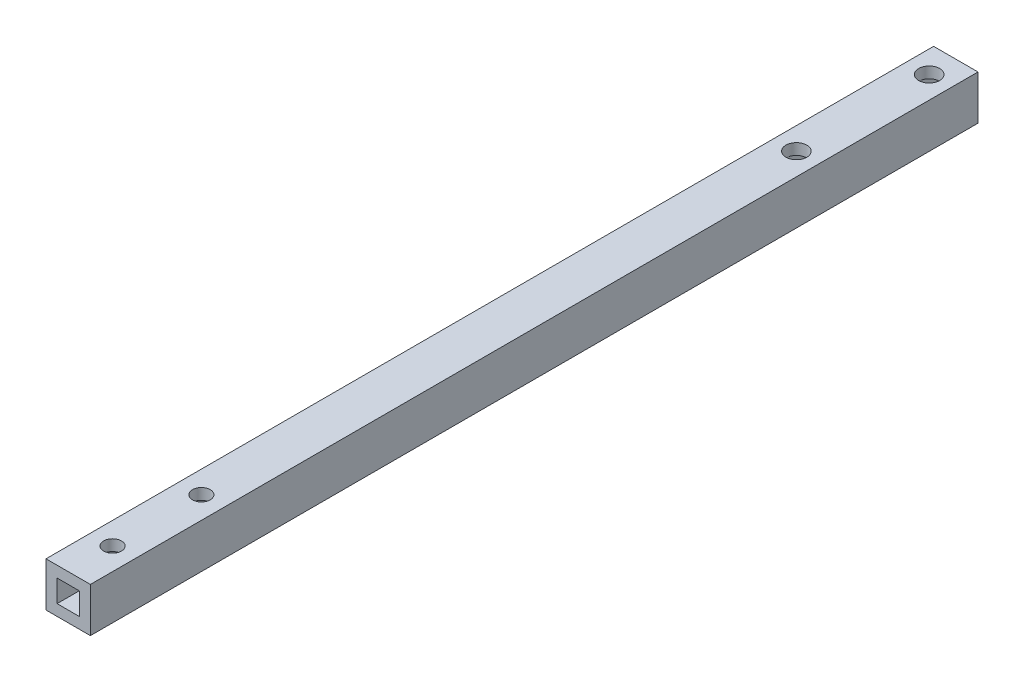
ISO-10303-21;
HEADER;
FILE_DESCRIPTION(('STEP AP214'),'2;1');
FILE_NAME('part.step','',(''),(''),'','','');
FILE_SCHEMA(('AUTOMOTIVE_DESIGN { 1 0 10303 214 1 1 1 1 }'));
ENDSEC;
DATA;
#1=APPLICATION_CONTEXT('core data for automotive mechanical design processes');
#2=APPLICATION_PROTOCOL_DEFINITION('international standard','automotive_design',2000,#1);
#3=PRODUCT_CONTEXT('',#1,'mechanical');
#4=PRODUCT('Part','Part','',(#3));
#5=PRODUCT_RELATED_PRODUCT_CATEGORY('part','',(#4));
#6=PRODUCT_DEFINITION_FORMATION('','',#4);
#7=PRODUCT_DEFINITION_CONTEXT('part definition',#1,'design');
#8=PRODUCT_DEFINITION('design','',#6,#7);
#9=PRODUCT_DEFINITION_SHAPE('','',#8);
#10=(LENGTH_UNIT() NAMED_UNIT(*) SI_UNIT(.MILLI.,.METRE.));
#11=(NAMED_UNIT(*) PLANE_ANGLE_UNIT() SI_UNIT($,.RADIAN.));
#12=(NAMED_UNIT(*) SI_UNIT($,.STERADIAN.) SOLID_ANGLE_UNIT());
#13=UNCERTAINTY_MEASURE_WITH_UNIT(LENGTH_MEASURE(1.E-05),#10,'distance_accuracy_value','');
#14=(GEOMETRIC_REPRESENTATION_CONTEXT(3) GLOBAL_UNCERTAINTY_ASSIGNED_CONTEXT((#13)) GLOBAL_UNIT_ASSIGNED_CONTEXT((#10,
#11,#12)) REPRESENTATION_CONTEXT('',''));
#15=CARTESIAN_POINT('',(0.,0.,0.));
#16=DIRECTION('',(0.,0.,1.));
#17=DIRECTION('',(1.,0.,0.));
#18=AXIS2_PLACEMENT_3D('',#15,#16,#17);
#19=CARTESIAN_POINT('',(0.,0.,127.));
#20=DIRECTION('',(0.,0.,-1.));
#21=DIRECTION('',(-1.,0.,0.));
#22=AXIS2_PLACEMENT_3D('',#19,#20,#21);
#23=PLANE('',#22);
#24=DIRECTION('',(0.,1.,0.));
#25=VECTOR('',#24,1.);
#26=CARTESIAN_POINT('',(3.175,-3.175,127.));
#27=LINE('',#26,#25);
#28=CARTESIAN_POINT('',(3.175,-3.175,127.));
#29=VERTEX_POINT('',#28);
#30=CARTESIAN_POINT('',(3.175,3.175,127.));
#31=VERTEX_POINT('',#30);
#32=EDGE_CURVE('E138',#29,#31,#27,.T.);
#33=ORIENTED_EDGE('',*,*,#32,.T.);
#34=DIRECTION('',(-1.,0.,0.));
#35=VECTOR('',#34,1.);
#36=CARTESIAN_POINT('',(-3.175,3.175,127.));
#37=LINE('',#36,#35);
#38=CARTESIAN_POINT('',(-3.175,3.175,127.));
#39=VERTEX_POINT('',#38);
#40=EDGE_CURVE('E141',#31,#39,#37,.T.);
#41=ORIENTED_EDGE('',*,*,#40,.T.);
#42=DIRECTION('',(0.,-1.,0.));
#43=VECTOR('',#42,1.);
#44=CARTESIAN_POINT('',(-3.175,-3.175,127.));
#45=LINE('',#44,#43);
#46=CARTESIAN_POINT('',(-3.175,-3.175,127.));
#47=VERTEX_POINT('',#46);
#48=EDGE_CURVE('E144',#39,#47,#45,.T.);
#49=ORIENTED_EDGE('',*,*,#48,.T.);
#50=DIRECTION('',(1.,0.,0.));
#51=VECTOR('',#50,1.);
#52=CARTESIAN_POINT('',(-3.175,-3.175,127.));
#53=LINE('',#52,#51);
#54=EDGE_CURVE('E146',#47,#29,#53,.T.);
#55=ORIENTED_EDGE('',*,*,#54,.T.);
#56=EDGE_LOOP('',(#33,#41,#49,#55));
#57=FACE_BOUND('',#56,.T.);
#58=DIRECTION('',(0.,1.,0.));
#59=VECTOR('',#58,1.);
#60=CARTESIAN_POINT('',(1.5875,-1.5875,127.));
#61=LINE('',#60,#59);
#62=CARTESIAN_POINT('',(1.5875,-1.5875,127.));
#63=VERTEX_POINT('',#62);
#64=CARTESIAN_POINT('',(1.5875,1.5875,127.));
#65=VERTEX_POINT('',#64);
#66=EDGE_CURVE('E100',#63,#65,#61,.T.);
#67=ORIENTED_EDGE('',*,*,#66,.F.);
#68=DIRECTION('',(1.,0.,0.));
#69=VECTOR('',#68,1.);
#70=CARTESIAN_POINT('',(-1.5875,-1.5875,127.));
#71=LINE('',#70,#69);
#72=CARTESIAN_POINT('',(-1.5875,-1.5875,127.));
#73=VERTEX_POINT('',#72);
#74=EDGE_CURVE('E122',#73,#63,#71,.T.);
#75=ORIENTED_EDGE('',*,*,#74,.F.);
#76=DIRECTION('',(0.,-1.,0.));
#77=VECTOR('',#76,1.);
#78=CARTESIAN_POINT('',(-1.5875,-1.5875,127.));
#79=LINE('',#78,#77);
#80=CARTESIAN_POINT('',(-1.5875,1.5875,127.));
#81=VERTEX_POINT('',#80);
#82=EDGE_CURVE('E120',#81,#73,#79,.T.);
#83=ORIENTED_EDGE('',*,*,#82,.F.);
#84=DIRECTION('',(-1.,0.,0.));
#85=VECTOR('',#84,1.);
#86=CARTESIAN_POINT('',(-1.5875,1.5875,127.));
#87=LINE('',#86,#85);
#88=EDGE_CURVE('E108',#65,#81,#87,.T.);
#89=ORIENTED_EDGE('',*,*,#88,.F.);
#90=EDGE_LOOP('',(#67,#75,#83,#89));
#91=FACE_BOUND('',#90,.T.);
#92=ADVANCED_FACE('F33',(#57,#91),#23,.F.);
#93=CARTESIAN_POINT('',(0.,0.,0.));
#94=DIRECTION('',(0.,0.,-1.));
#95=DIRECTION('',(-1.,0.,0.));
#96=AXIS2_PLACEMENT_3D('',#93,#94,#95);
#97=PLANE('',#96);
#98=DIRECTION('',(0.,1.,0.));
#99=VECTOR('',#98,1.);
#100=CARTESIAN_POINT('',(3.175,-3.175,0.));
#101=LINE('',#100,#99);
#102=CARTESIAN_POINT('',(3.175,-3.175,0.));
#103=VERTEX_POINT('',#102);
#104=CARTESIAN_POINT('',(3.175,3.175,0.));
#105=VERTEX_POINT('',#104);
#106=EDGE_CURVE('E116',#103,#105,#101,.T.);
#107=ORIENTED_EDGE('',*,*,#106,.F.);
#108=DIRECTION('',(1.,0.,0.));
#109=VECTOR('',#108,1.);
#110=CARTESIAN_POINT('',(-3.175,-3.175,0.));
#111=LINE('',#110,#109);
#112=CARTESIAN_POINT('',(-3.175,-3.175,0.));
#113=VERTEX_POINT('',#112);
#114=EDGE_CURVE('E142',#113,#103,#111,.T.);
#115=ORIENTED_EDGE('',*,*,#114,.F.);
#116=DIRECTION('',(0.,-1.,0.));
#117=VECTOR('',#116,1.);
#118=CARTESIAN_POINT('',(-3.175,-3.175,0.));
#119=LINE('',#118,#117);
#120=CARTESIAN_POINT('',(-3.175,3.175,0.));
#121=VERTEX_POINT('',#120);
#122=EDGE_CURVE('E153',#121,#113,#119,.T.);
#123=ORIENTED_EDGE('',*,*,#122,.F.);
#124=DIRECTION('',(-1.,0.,0.));
#125=VECTOR('',#124,1.);
#126=CARTESIAN_POINT('',(-3.175,3.175,0.));
#127=LINE('',#126,#125);
#128=EDGE_CURVE('E151',#105,#121,#127,.T.);
#129=ORIENTED_EDGE('',*,*,#128,.F.);
#130=EDGE_LOOP('',(#107,#115,#123,#129));
#131=FACE_BOUND('',#130,.T.);
#132=DIRECTION('',(1.,0.,0.));
#133=VECTOR('',#132,1.);
#134=CARTESIAN_POINT('',(-1.5875,-1.5875,0.));
#135=LINE('',#134,#133);
#136=CARTESIAN_POINT('',(-1.5875,-1.5875,0.));
#137=VERTEX_POINT('',#136);
#138=CARTESIAN_POINT('',(1.5875,-1.5875,0.));
#139=VERTEX_POINT('',#138);
#140=EDGE_CURVE('E109',#137,#139,#135,.T.);
#141=ORIENTED_EDGE('',*,*,#140,.T.);
#142=DIRECTION('',(0.,1.,0.));
#143=VECTOR('',#142,1.);
#144=CARTESIAN_POINT('',(1.5875,-1.5875,0.));
#145=LINE('',#144,#143);
#146=CARTESIAN_POINT('',(1.5875,1.5875,0.));
#147=VERTEX_POINT('',#146);
#148=EDGE_CURVE('E58',#139,#147,#145,.T.);
#149=ORIENTED_EDGE('',*,*,#148,.T.);
#150=DIRECTION('',(-1.,0.,0.));
#151=VECTOR('',#150,1.);
#152=CARTESIAN_POINT('',(-1.5875,1.5875,0.));
#153=LINE('',#152,#151);
#154=CARTESIAN_POINT('',(-1.5875,1.5875,0.));
#155=VERTEX_POINT('',#154);
#156=EDGE_CURVE('E115',#147,#155,#153,.T.);
#157=ORIENTED_EDGE('',*,*,#156,.T.);
#158=DIRECTION('',(0.,-1.,0.));
#159=VECTOR('',#158,1.);
#160=CARTESIAN_POINT('',(-1.5875,-1.5875,0.));
#161=LINE('',#160,#159);
#162=EDGE_CURVE('E130',#155,#137,#161,.T.);
#163=ORIENTED_EDGE('',*,*,#162,.T.);
#164=EDGE_LOOP('',(#141,#149,#157,#163));
#165=FACE_BOUND('',#164,.T.);
#166=ADVANCED_FACE('F226',(#131,#165),#97,.T.);
#167=CARTESIAN_POINT('',(3.175,-3.175,127.));
#168=DIRECTION('',(-1.,0.,0.));
#169=DIRECTION('',(0.,0.,1.));
#170=AXIS2_PLACEMENT_3D('',#167,#168,#169);
#171=PLANE('',#170);
#172=ORIENTED_EDGE('',*,*,#106,.T.);
#173=DIRECTION('',(0.,0.,-1.));
#174=VECTOR('',#173,1.);
#175=CARTESIAN_POINT('',(3.175,3.175,127.));
#176=LINE('',#175,#174);
#177=EDGE_CURVE('E11',#31,#105,#176,.T.);
#178=ORIENTED_EDGE('',*,*,#177,.F.);
#179=ORIENTED_EDGE('',*,*,#32,.F.);
#180=DIRECTION('',(0.,0.,-1.));
#181=VECTOR('',#180,1.);
#182=CARTESIAN_POINT('',(3.175,-3.175,127.));
#183=LINE('',#182,#181);
#184=EDGE_CURVE('E148',#29,#103,#183,.T.);
#185=ORIENTED_EDGE('',*,*,#184,.T.);
#186=EDGE_LOOP('',(#172,#178,#179,#185));
#187=FACE_BOUND('',#186,.T.);
#188=ADVANCED_FACE('F35',(#187),#171,.F.);
#189=CARTESIAN_POINT('',(-3.175,3.175,127.));
#190=DIRECTION('',(0.,-1.,0.));
#191=DIRECTION('',(0.,0.,-1.));
#192=AXIS2_PLACEMENT_3D('',#189,#190,#191);
#193=PLANE('',#192);
#194=CARTESIAN_POINT('',(0.,3.175,22.81));
#195=DIRECTION('',(0.,1.,0.));
#196=DIRECTION('',(0.,0.,-1.));
#197=AXIS2_PLACEMENT_3D('',#194,#195,#196);
#198=CIRCLE('',#197,1.5);
#199=CARTESIAN_POINT('',(0.,3.175,21.31));
#200=VERTEX_POINT('',#199);
#201=EDGE_CURVE('E253',#200,#200,#198,.T.);
#202=ORIENTED_EDGE('',*,*,#201,.F.);
#203=EDGE_LOOP('',(#202));
#204=FACE_BOUND('',#203,.T.);
#205=CARTESIAN_POINT('',(0.,3.175,3.81));
#206=DIRECTION('',(0.,1.,0.));
#207=DIRECTION('',(0.,0.,1.));
#208=AXIS2_PLACEMENT_3D('',#205,#206,#207);
#209=CIRCLE('',#208,1.5);
#210=CARTESIAN_POINT('',(0.,3.175,5.31));
#211=VERTEX_POINT('',#210);
#212=EDGE_CURVE('E175',#211,#211,#209,.T.);
#213=ORIENTED_EDGE('',*,*,#212,.F.);
#214=EDGE_LOOP('',(#213));
#215=FACE_BOUND('',#214,.T.);
#216=CARTESIAN_POINT('',(0.,3.175,107.95));
#217=DIRECTION('',(0.,1.,0.));
#218=DIRECTION('',(0.,0.,1.));
#219=AXIS2_PLACEMENT_3D('',#216,#217,#218);
#220=CIRCLE('',#219,1.27000000000001);
#221=CARTESIAN_POINT('',(0.,3.175,109.22));
#222=VERTEX_POINT('',#221);
#223=EDGE_CURVE('E171',#222,#222,#220,.T.);
#224=ORIENTED_EDGE('',*,*,#223,.F.);
#225=EDGE_LOOP('',(#224));
#226=FACE_BOUND('',#225,.T.);
#227=CARTESIAN_POINT('',(0.,3.175,120.65));
#228=DIRECTION('',(0.,1.,0.));
#229=DIRECTION('',(0.,0.,1.));
#230=AXIS2_PLACEMENT_3D('',#227,#228,#229);
#231=CIRCLE('',#230,1.27000000000001);
#232=CARTESIAN_POINT('',(0.,3.175,121.92));
#233=VERTEX_POINT('',#232);
#234=EDGE_CURVE('E167',#233,#233,#231,.T.);
#235=ORIENTED_EDGE('',*,*,#234,.F.);
#236=EDGE_LOOP('',(#235));
#237=FACE_BOUND('',#236,.T.);
#238=ORIENTED_EDGE('',*,*,#128,.T.);
#239=DIRECTION('',(0.,0.,-1.));
#240=VECTOR('',#239,1.);
#241=CARTESIAN_POINT('',(-3.175,3.175,127.));
#242=LINE('',#241,#240);
#243=EDGE_CURVE('E42',#39,#121,#242,.T.);
#244=ORIENTED_EDGE('',*,*,#243,.F.);
#245=ORIENTED_EDGE('',*,*,#40,.F.);
#246=ORIENTED_EDGE('',*,*,#177,.T.);
#247=EDGE_LOOP('',(#238,#244,#245,#246));
#248=FACE_BOUND('',#247,.T.);
#249=ADVANCED_FACE('F242',(#204,#215,#226,#237,#248),#193,.F.);
#250=CARTESIAN_POINT('',(-3.175,-3.175,127.));
#251=DIRECTION('',(1.,0.,0.));
#252=DIRECTION('',(0.,0.,-1.));
#253=AXIS2_PLACEMENT_3D('',#250,#251,#252);
#254=PLANE('',#253);
#255=ORIENTED_EDGE('',*,*,#122,.T.);
#256=DIRECTION('',(0.,0.,-1.));
#257=VECTOR('',#256,1.);
#258=CARTESIAN_POINT('',(-3.175,-3.175,127.));
#259=LINE('',#258,#257);
#260=EDGE_CURVE('E158',#47,#113,#259,.T.);
#261=ORIENTED_EDGE('',*,*,#260,.F.);
#262=ORIENTED_EDGE('',*,*,#48,.F.);
#263=ORIENTED_EDGE('',*,*,#243,.T.);
#264=EDGE_LOOP('',(#255,#261,#262,#263));
#265=FACE_BOUND('',#264,.T.);
#266=ADVANCED_FACE('F239',(#265),#254,.F.);
#267=CARTESIAN_POINT('',(-3.175,-3.175,127.));
#268=DIRECTION('',(0.,1.,0.));
#269=DIRECTION('',(0.,0.,1.));
#270=AXIS2_PLACEMENT_3D('',#267,#268,#269);
#271=PLANE('',#270);
#272=CARTESIAN_POINT('',(0.,-3.175,22.81));
#273=DIRECTION('',(0.,1.,0.));
#274=DIRECTION('',(0.,0.,1.));
#275=AXIS2_PLACEMENT_3D('',#272,#273,#274);
#276=CIRCLE('',#275,1.5);
#277=CARTESIAN_POINT('',(0.,-3.175,24.31));
#278=VERTEX_POINT('',#277);
#279=EDGE_CURVE('E182',#278,#278,#276,.T.);
#280=ORIENTED_EDGE('',*,*,#279,.T.);
#281=EDGE_LOOP('',(#280));
#282=FACE_BOUND('',#281,.T.);
#283=CARTESIAN_POINT('',(0.,-3.175,3.81));
#284=DIRECTION('',(0.,1.,0.));
#285=DIRECTION('',(0.,0.,1.));
#286=AXIS2_PLACEMENT_3D('',#283,#284,#285);
#287=CIRCLE('',#286,1.5);
#288=CARTESIAN_POINT('',(0.,-3.175,5.31));
#289=VERTEX_POINT('',#288);
#290=EDGE_CURVE('E179',#289,#289,#287,.T.);
#291=ORIENTED_EDGE('',*,*,#290,.T.);
#292=EDGE_LOOP('',(#291));
#293=FACE_BOUND('',#292,.T.);
#294=CARTESIAN_POINT('',(0.,-3.175,107.95));
#295=DIRECTION('',(0.,1.,0.));
#296=DIRECTION('',(0.,0.,1.));
#297=AXIS2_PLACEMENT_3D('',#294,#295,#296);
#298=CIRCLE('',#297,1.27000000000001);
#299=CARTESIAN_POINT('',(0.,-3.175,109.22));
#300=VERTEX_POINT('',#299);
#301=EDGE_CURVE('E197',#300,#300,#298,.T.);
#302=ORIENTED_EDGE('',*,*,#301,.T.);
#303=EDGE_LOOP('',(#302));
#304=FACE_BOUND('',#303,.T.);
#305=CARTESIAN_POINT('',(0.,-3.175,120.65));
#306=DIRECTION('',(0.,1.,0.));
#307=DIRECTION('',(0.,0.,1.));
#308=AXIS2_PLACEMENT_3D('',#305,#306,#307);
#309=CIRCLE('',#308,1.27000000000001);
#310=CARTESIAN_POINT('',(0.,-3.175,121.92));
#311=VERTEX_POINT('',#310);
#312=EDGE_CURVE('E128',#311,#311,#309,.T.);
#313=ORIENTED_EDGE('',*,*,#312,.T.);
#314=EDGE_LOOP('',(#313));
#315=FACE_BOUND('',#314,.T.);
#316=ORIENTED_EDGE('',*,*,#114,.T.);
#317=ORIENTED_EDGE('',*,*,#184,.F.);
#318=ORIENTED_EDGE('',*,*,#54,.F.);
#319=ORIENTED_EDGE('',*,*,#260,.T.);
#320=EDGE_LOOP('',(#316,#317,#318,#319));
#321=FACE_BOUND('',#320,.T.);
#322=ADVANCED_FACE('F206',(#282,#293,#304,#315,#321),#271,.F.);
#323=CARTESIAN_POINT('',(1.5875,-1.5875,127.));
#324=DIRECTION('',(-1.,0.,0.));
#325=DIRECTION('',(0.,0.,1.));
#326=AXIS2_PLACEMENT_3D('',#323,#324,#325);
#327=PLANE('',#326);
#328=ORIENTED_EDGE('',*,*,#148,.F.);
#329=DIRECTION('',(0.,0.,-1.));
#330=VECTOR('',#329,1.);
#331=CARTESIAN_POINT('',(1.5875,-1.5875,127.));
#332=LINE('',#331,#330);
#333=EDGE_CURVE('E104',#63,#139,#332,.T.);
#334=ORIENTED_EDGE('',*,*,#333,.F.);
#335=ORIENTED_EDGE('',*,*,#66,.T.);
#336=DIRECTION('',(0.,0.,-1.));
#337=VECTOR('',#336,1.);
#338=CARTESIAN_POINT('',(1.5875,1.5875,127.));
#339=LINE('',#338,#337);
#340=EDGE_CURVE('E103',#65,#147,#339,.T.);
#341=ORIENTED_EDGE('',*,*,#340,.T.);
#342=EDGE_LOOP('',(#328,#334,#335,#341));
#343=FACE_BOUND('',#342,.T.);
#344=ADVANCED_FACE('F102',(#343),#327,.T.);
#345=CARTESIAN_POINT('',(-1.5875,1.5875,127.));
#346=DIRECTION('',(0.,-1.,0.));
#347=DIRECTION('',(0.,0.,-1.));
#348=AXIS2_PLACEMENT_3D('',#345,#346,#347);
#349=PLANE('',#348);
#350=CARTESIAN_POINT('',(0.,1.5875,22.81));
#351=DIRECTION('',(0.,-1.,0.));
#352=DIRECTION('',(0.,0.,-1.));
#353=AXIS2_PLACEMENT_3D('',#350,#351,#352);
#354=CIRCLE('',#353,1.5);
#355=CARTESIAN_POINT('',(0.,1.5875,21.31));
#356=VERTEX_POINT('',#355);
#357=EDGE_CURVE('E187',#356,#356,#354,.T.);
#358=ORIENTED_EDGE('',*,*,#357,.F.);
#359=EDGE_LOOP('',(#358));
#360=FACE_BOUND('',#359,.T.);
#361=CARTESIAN_POINT('',(0.,1.5875,3.81));
#362=DIRECTION('',(0.,-1.,0.));
#363=DIRECTION('',(0.,0.,-1.));
#364=AXIS2_PLACEMENT_3D('',#361,#362,#363);
#365=CIRCLE('',#364,1.5);
#366=CARTESIAN_POINT('',(0.,1.5875,2.31));
#367=VERTEX_POINT('',#366);
#368=EDGE_CURVE('E174',#367,#367,#365,.T.);
#369=ORIENTED_EDGE('',*,*,#368,.F.);
#370=EDGE_LOOP('',(#369));
#371=FACE_BOUND('',#370,.T.);
#372=CARTESIAN_POINT('',(0.,1.5875,107.95));
#373=DIRECTION('',(0.,-1.,0.));
#374=DIRECTION('',(0.,0.,-1.));
#375=AXIS2_PLACEMENT_3D('',#372,#373,#374);
#376=CIRCLE('',#375,1.27000000000001);
#377=CARTESIAN_POINT('',(0.,1.5875,106.68));
#378=VERTEX_POINT('',#377);
#379=EDGE_CURVE('E170',#378,#378,#376,.T.);
#380=ORIENTED_EDGE('',*,*,#379,.F.);
#381=EDGE_LOOP('',(#380));
#382=FACE_BOUND('',#381,.T.);
#383=CARTESIAN_POINT('',(0.,1.5875,120.65));
#384=DIRECTION('',(0.,-1.,0.));
#385=DIRECTION('',(0.,0.,-1.));
#386=AXIS2_PLACEMENT_3D('',#383,#384,#385);
#387=CIRCLE('',#386,1.27000000000001);
#388=CARTESIAN_POINT('',(0.,1.5875,119.38));
#389=VERTEX_POINT('',#388);
#390=EDGE_CURVE('E166',#389,#389,#387,.T.);
#391=ORIENTED_EDGE('',*,*,#390,.F.);
#392=EDGE_LOOP('',(#391));
#393=FACE_BOUND('',#392,.T.);
#394=ORIENTED_EDGE('',*,*,#156,.F.);
#395=ORIENTED_EDGE('',*,*,#340,.F.);
#396=ORIENTED_EDGE('',*,*,#88,.T.);
#397=DIRECTION('',(0.,0.,-1.));
#398=VECTOR('',#397,1.);
#399=CARTESIAN_POINT('',(-1.5875,1.5875,127.));
#400=LINE('',#399,#398);
#401=EDGE_CURVE('E117',#81,#155,#400,.T.);
#402=ORIENTED_EDGE('',*,*,#401,.T.);
#403=EDGE_LOOP('',(#394,#395,#396,#402));
#404=FACE_BOUND('',#403,.T.);
#405=ADVANCED_FACE('F112',(#360,#371,#382,#393,#404),#349,.T.);
#406=CARTESIAN_POINT('',(-1.5875,-1.5875,127.));
#407=DIRECTION('',(1.,0.,0.));
#408=DIRECTION('',(0.,0.,-1.));
#409=AXIS2_PLACEMENT_3D('',#406,#407,#408);
#410=PLANE('',#409);
#411=ORIENTED_EDGE('',*,*,#162,.F.);
#412=ORIENTED_EDGE('',*,*,#401,.F.);
#413=ORIENTED_EDGE('',*,*,#82,.T.);
#414=DIRECTION('',(0.,0.,-1.));
#415=VECTOR('',#414,1.);
#416=CARTESIAN_POINT('',(-1.5875,-1.5875,127.));
#417=LINE('',#416,#415);
#418=EDGE_CURVE('E50',#73,#137,#417,.T.);
#419=ORIENTED_EDGE('',*,*,#418,.T.);
#420=EDGE_LOOP('',(#411,#412,#413,#419));
#421=FACE_BOUND('',#420,.T.);
#422=ADVANCED_FACE('F221',(#421),#410,.T.);
#423=CARTESIAN_POINT('',(-1.5875,-1.5875,127.));
#424=DIRECTION('',(0.,1.,0.));
#425=DIRECTION('',(0.,0.,1.));
#426=AXIS2_PLACEMENT_3D('',#423,#424,#425);
#427=PLANE('',#426);
#428=CARTESIAN_POINT('',(0.,-1.5875,22.81));
#429=DIRECTION('',(0.,1.,0.));
#430=DIRECTION('',(0.,0.,1.));
#431=AXIS2_PLACEMENT_3D('',#428,#429,#430);
#432=CIRCLE('',#431,1.5);
#433=CARTESIAN_POINT('',(0.,-1.5875,24.31));
#434=VERTEX_POINT('',#433);
#435=EDGE_CURVE('E37',#434,#434,#432,.T.);
#436=ORIENTED_EDGE('',*,*,#435,.F.);
#437=EDGE_LOOP('',(#436));
#438=FACE_BOUND('',#437,.T.);
#439=CARTESIAN_POINT('',(0.,-1.5875,3.81));
#440=DIRECTION('',(0.,1.,0.));
#441=DIRECTION('',(0.,0.,1.));
#442=AXIS2_PLACEMENT_3D('',#439,#440,#441);
#443=CIRCLE('',#442,1.5);
#444=CARTESIAN_POINT('',(0.,-1.5875,5.31));
#445=VERTEX_POINT('',#444);
#446=EDGE_CURVE('E172',#445,#445,#443,.T.);
#447=ORIENTED_EDGE('',*,*,#446,.F.);
#448=EDGE_LOOP('',(#447));
#449=FACE_BOUND('',#448,.T.);
#450=CARTESIAN_POINT('',(0.,-1.5875,107.95));
#451=DIRECTION('',(0.,1.,0.));
#452=DIRECTION('',(0.,0.,1.));
#453=AXIS2_PLACEMENT_3D('',#450,#451,#452);
#454=CIRCLE('',#453,1.27000000000001);
#455=CARTESIAN_POINT('',(0.,-1.5875,109.22));
#456=VERTEX_POINT('',#455);
#457=EDGE_CURVE('E168',#456,#456,#454,.T.);
#458=ORIENTED_EDGE('',*,*,#457,.F.);
#459=EDGE_LOOP('',(#458));
#460=FACE_BOUND('',#459,.T.);
#461=CARTESIAN_POINT('',(0.,-1.5875,120.65));
#462=DIRECTION('',(0.,1.,0.));
#463=DIRECTION('',(0.,0.,1.));
#464=AXIS2_PLACEMENT_3D('',#461,#462,#463);
#465=CIRCLE('',#464,1.27000000000001);
#466=CARTESIAN_POINT('',(0.,-1.5875,121.92));
#467=VERTEX_POINT('',#466);
#468=EDGE_CURVE('E163',#467,#467,#465,.T.);
#469=ORIENTED_EDGE('',*,*,#468,.F.);
#470=EDGE_LOOP('',(#469));
#471=FACE_BOUND('',#470,.T.);
#472=ORIENTED_EDGE('',*,*,#140,.F.);
#473=ORIENTED_EDGE('',*,*,#418,.F.);
#474=ORIENTED_EDGE('',*,*,#74,.T.);
#475=ORIENTED_EDGE('',*,*,#333,.T.);
#476=EDGE_LOOP('',(#472,#473,#474,#475));
#477=FACE_BOUND('',#476,.T.);
#478=ADVANCED_FACE('F212',(#438,#449,#460,#471,#477),#427,.T.);
#479=CARTESIAN_POINT('',(0.,-9.525,120.65));
#480=DIRECTION('',(0.,1.,0.));
#481=DIRECTION('',(0.,0.,1.));
#482=AXIS2_PLACEMENT_3D('',#479,#480,#481);
#483=CYLINDRICAL_SURFACE('',#482,1.27000000000001);
#484=ORIENTED_EDGE('',*,*,#468,.T.);
#485=EDGE_LOOP('',(#484));
#486=FACE_BOUND('',#485,.T.);
#487=ORIENTED_EDGE('',*,*,#312,.F.);
#488=EDGE_LOOP('',(#487));
#489=FACE_BOUND('',#488,.T.);
#490=ADVANCED_FACE('F209',(#486,#489),#483,.F.);
#491=ORIENTED_EDGE('',*,*,#390,.T.);
#492=EDGE_LOOP('',(#491));
#493=FACE_BOUND('',#492,.T.);
#494=ORIENTED_EDGE('',*,*,#234,.T.);
#495=EDGE_LOOP('',(#494));
#496=FACE_BOUND('',#495,.T.);
#497=ADVANCED_FACE('F211',(#493,#496),#483,.F.);
#498=CARTESIAN_POINT('',(0.,-9.525,107.95));
#499=DIRECTION('',(0.,1.,0.));
#500=DIRECTION('',(0.,0.,1.));
#501=AXIS2_PLACEMENT_3D('',#498,#499,#500);
#502=CYLINDRICAL_SURFACE('',#501,1.27000000000001);
#503=ORIENTED_EDGE('',*,*,#457,.T.);
#504=EDGE_LOOP('',(#503));
#505=FACE_BOUND('',#504,.T.);
#506=ORIENTED_EDGE('',*,*,#301,.F.);
#507=EDGE_LOOP('',(#506));
#508=FACE_BOUND('',#507,.T.);
#509=ADVANCED_FACE('F219',(#505,#508),#502,.F.);
#510=ORIENTED_EDGE('',*,*,#379,.T.);
#511=EDGE_LOOP('',(#510));
#512=FACE_BOUND('',#511,.T.);
#513=ORIENTED_EDGE('',*,*,#223,.T.);
#514=EDGE_LOOP('',(#513));
#515=FACE_BOUND('',#514,.T.);
#516=ADVANCED_FACE('F291',(#512,#515),#502,.F.);
#517=CARTESIAN_POINT('',(0.,-9.525,3.81));
#518=DIRECTION('',(0.,1.,0.));
#519=DIRECTION('',(0.,0.,1.));
#520=AXIS2_PLACEMENT_3D('',#517,#518,#519);
#521=CYLINDRICAL_SURFACE('',#520,1.5);
#522=ORIENTED_EDGE('',*,*,#446,.T.);
#523=EDGE_LOOP('',(#522));
#524=FACE_BOUND('',#523,.T.);
#525=ORIENTED_EDGE('',*,*,#290,.F.);
#526=EDGE_LOOP('',(#525));
#527=FACE_BOUND('',#526,.T.);
#528=ADVANCED_FACE('F294',(#524,#527),#521,.F.);
#529=ORIENTED_EDGE('',*,*,#368,.T.);
#530=EDGE_LOOP('',(#529));
#531=FACE_BOUND('',#530,.T.);
#532=ORIENTED_EDGE('',*,*,#212,.T.);
#533=EDGE_LOOP('',(#532));
#534=FACE_BOUND('',#533,.T.);
#535=ADVANCED_FACE('F299',(#531,#534),#521,.F.);
#536=CARTESIAN_POINT('',(0.,-9.525,22.81));
#537=DIRECTION('',(0.,1.,0.));
#538=DIRECTION('',(0.,0.,1.));
#539=AXIS2_PLACEMENT_3D('',#536,#537,#538);
#540=CYLINDRICAL_SURFACE('',#539,1.5);
#541=ORIENTED_EDGE('',*,*,#435,.T.);
#542=EDGE_LOOP('',(#541));
#543=FACE_BOUND('',#542,.T.);
#544=ORIENTED_EDGE('',*,*,#279,.F.);
#545=EDGE_LOOP('',(#544));
#546=FACE_BOUND('',#545,.T.);
#547=ADVANCED_FACE('F303',(#543,#546),#540,.F.);
#548=ORIENTED_EDGE('',*,*,#357,.T.);
#549=EDGE_LOOP('',(#548));
#550=FACE_BOUND('',#549,.T.);
#551=ORIENTED_EDGE('',*,*,#201,.T.);
#552=EDGE_LOOP('',(#551));
#553=FACE_BOUND('',#552,.T.);
#554=ADVANCED_FACE('F305',(#550,#553),#540,.F.);
#555=CLOSED_SHELL('',(#92,#166,#188,#249,#266,#322,#344,#405,#422,#478,#490,#497,#509,#516,#528,
#535,#547,#554));
#556=MANIFOLD_SOLID_BREP('B2',#555);
#557=ADVANCED_BREP_SHAPE_REPRESENTATION('',(#18,#556),#14);
#558=SHAPE_DEFINITION_REPRESENTATION(#9,#557);
ENDSEC;
END-ISO-10303-21;
